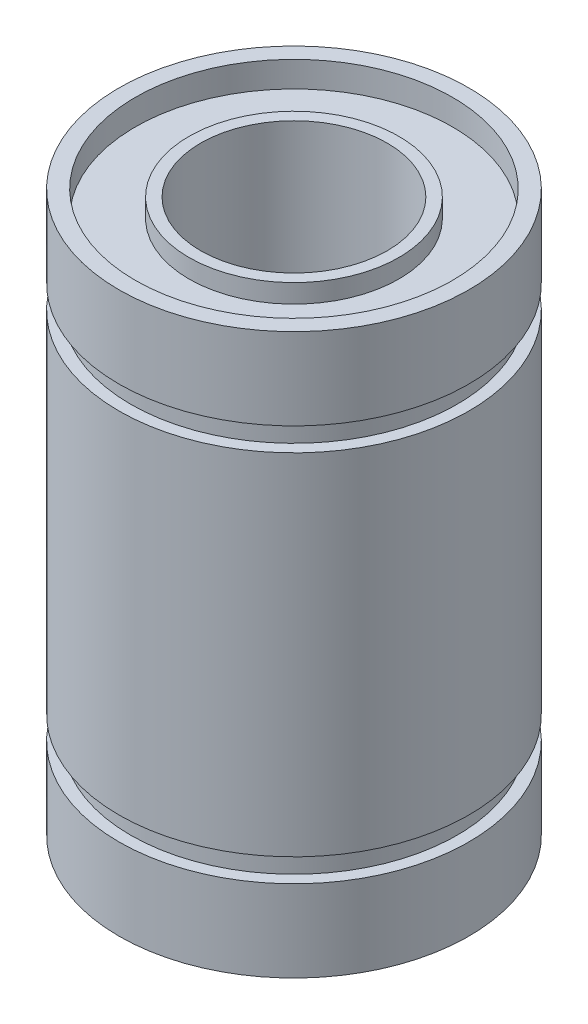
ISO-10303-21;
HEADER;
FILE_DESCRIPTION(('STEP AP214'),'2;1');
FILE_NAME('part.step','',(''),(''),'','','');
FILE_SCHEMA(('AUTOMOTIVE_DESIGN { 1 0 10303 214 1 1 1 1 }'));
ENDSEC;
DATA;
#1=APPLICATION_CONTEXT('core data for automotive mechanical design processes');
#2=APPLICATION_PROTOCOL_DEFINITION('international standard','automotive_design',2000,#1);
#3=PRODUCT_CONTEXT('',#1,'mechanical');
#4=PRODUCT('Part','Part','',(#3));
#5=PRODUCT_RELATED_PRODUCT_CATEGORY('part','',(#4));
#6=PRODUCT_DEFINITION_FORMATION('','',#4);
#7=PRODUCT_DEFINITION_CONTEXT('part definition',#1,'design');
#8=PRODUCT_DEFINITION('design','',#6,#7);
#9=PRODUCT_DEFINITION_SHAPE('','',#8);
#10=(LENGTH_UNIT() NAMED_UNIT(*) SI_UNIT(.MILLI.,.METRE.));
#11=(NAMED_UNIT(*) PLANE_ANGLE_UNIT() SI_UNIT($,.RADIAN.));
#12=(NAMED_UNIT(*) SI_UNIT($,.STERADIAN.) SOLID_ANGLE_UNIT());
#13=UNCERTAINTY_MEASURE_WITH_UNIT(LENGTH_MEASURE(1.E-05),#10,'distance_accuracy_value','');
#14=(GEOMETRIC_REPRESENTATION_CONTEXT(3) GLOBAL_UNCERTAINTY_ASSIGNED_CONTEXT((#13)) GLOBAL_UNIT_ASSIGNED_CONTEXT((#10,
#11,#12)) REPRESENTATION_CONTEXT('',''));
#15=CARTESIAN_POINT('',(0.,0.,0.));
#16=DIRECTION('',(0.,0.,1.));
#17=DIRECTION('',(1.,0.,0.));
#18=AXIS2_PLACEMENT_3D('',#15,#16,#17);
#19=CARTESIAN_POINT('',(0.,-12.,0.));
#20=DIRECTION('',(0.,1.,0.));
#21=DIRECTION('',(0.,0.,1.));
#22=AXIS2_PLACEMENT_3D('',#19,#20,#21);
#23=CYLINDRICAL_SURFACE('',#22,4.);
#24=CARTESIAN_POINT('',(0.,11.7,0.));
#25=DIRECTION('',(0.,1.,0.));
#26=DIRECTION('',(0.,0.,1.));
#27=AXIS2_PLACEMENT_3D('',#24,#25,#26);
#28=CIRCLE('',#27,4.);
#29=CARTESIAN_POINT('',(0.,11.7,4.));
#30=VERTEX_POINT('',#29);
#31=EDGE_CURVE('E78',#30,#30,#28,.T.);
#32=ORIENTED_EDGE('',*,*,#31,.T.);
#33=EDGE_LOOP('',(#32));
#34=FACE_BOUND('',#33,.T.);
#35=CARTESIAN_POINT('',(0.,-11.7,0.));
#36=DIRECTION('',(0.,1.,0.));
#37=DIRECTION('',(0.,0.,1.));
#38=AXIS2_PLACEMENT_3D('',#35,#36,#37);
#39=CIRCLE('',#38,4.);
#40=CARTESIAN_POINT('',(0.,-11.7,4.));
#41=VERTEX_POINT('',#40);
#42=EDGE_CURVE('E114',#41,#41,#39,.T.);
#43=ORIENTED_EDGE('',*,*,#42,.F.);
#44=EDGE_LOOP('',(#43));
#45=FACE_BOUND('',#44,.T.);
#46=ADVANCED_FACE('F44',(#34,#45),#23,.F.);
#47=CARTESIAN_POINT('',(0.,-12.,0.));
#48=DIRECTION('',(0.,1.,0.));
#49=DIRECTION('',(0.,0.,1.));
#50=AXIS2_PLACEMENT_3D('',#47,#48,#49);
#51=PLANE('',#50);
#52=CARTESIAN_POINT('',(0.,-12.,0.));
#53=DIRECTION('',(0.,1.,0.));
#54=DIRECTION('',(0.,0.,1.));
#55=AXIS2_PLACEMENT_3D('',#52,#53,#54);
#56=CIRCLE('',#55,7.5);
#57=CARTESIAN_POINT('',(0.,-12.,7.5));
#58=VERTEX_POINT('',#57);
#59=EDGE_CURVE('E48',#58,#58,#56,.T.);
#60=ORIENTED_EDGE('',*,*,#59,.F.);
#61=EDGE_LOOP('',(#60));
#62=FACE_BOUND('',#61,.T.);
#63=CARTESIAN_POINT('',(0.,-12.,0.));
#64=DIRECTION('',(0.,1.,0.));
#65=DIRECTION('',(0.,0.,1.));
#66=AXIS2_PLACEMENT_3D('',#63,#64,#65);
#67=CIRCLE('',#66,6.8);
#68=CARTESIAN_POINT('',(0.,-12.,6.8));
#69=VERTEX_POINT('',#68);
#70=EDGE_CURVE('E107',#69,#69,#67,.T.);
#71=ORIENTED_EDGE('',*,*,#70,.T.);
#72=EDGE_LOOP('',(#71));
#73=FACE_BOUND('',#72,.T.);
#74=ADVANCED_FACE('F152',(#62,#73),#51,.F.);
#75=CARTESIAN_POINT('',(0.,12.,0.));
#76=DIRECTION('',(0.,-1.,0.));
#77=DIRECTION('',(0.,0.,-1.));
#78=AXIS2_PLACEMENT_3D('',#75,#76,#77);
#79=CYLINDRICAL_SURFACE('',#78,7.5);
#80=CARTESIAN_POINT('',(0.,7.5,0.));
#81=DIRECTION('',(0.,1.,0.));
#82=DIRECTION('',(0.,0.,1.));
#83=AXIS2_PLACEMENT_3D('',#80,#81,#82);
#84=CIRCLE('',#83,7.5);
#85=CARTESIAN_POINT('',(0.,7.5,7.5));
#86=VERTEX_POINT('',#85);
#87=EDGE_CURVE('E57',#86,#86,#84,.T.);
#88=ORIENTED_EDGE('',*,*,#87,.F.);
#89=EDGE_LOOP('',(#88));
#90=FACE_BOUND('',#89,.T.);
#91=CARTESIAN_POINT('',(0.,-7.5,0.));
#92=DIRECTION('',(0.,1.,0.));
#93=DIRECTION('',(0.,0.,1.));
#94=AXIS2_PLACEMENT_3D('',#91,#92,#93);
#95=CIRCLE('',#94,7.5);
#96=CARTESIAN_POINT('',(0.,-7.5,7.5));
#97=VERTEX_POINT('',#96);
#98=EDGE_CURVE('E94',#97,#97,#95,.T.);
#99=ORIENTED_EDGE('',*,*,#98,.T.);
#100=EDGE_LOOP('',(#99));
#101=FACE_BOUND('',#100,.T.);
#102=ADVANCED_FACE('F158',(#90,#101),#79,.T.);
#103=CARTESIAN_POINT('',(0.,12.,0.));
#104=DIRECTION('',(0.,1.,0.));
#105=DIRECTION('',(0.,0.,1.));
#106=AXIS2_PLACEMENT_3D('',#103,#104,#105);
#107=PLANE('',#106);
#108=CARTESIAN_POINT('',(0.,12.,0.));
#109=DIRECTION('',(0.,1.,0.));
#110=DIRECTION('',(0.,0.,1.));
#111=AXIS2_PLACEMENT_3D('',#108,#109,#110);
#112=CIRCLE('',#111,7.5);
#113=CARTESIAN_POINT('',(0.,12.,7.5));
#114=VERTEX_POINT('',#113);
#115=EDGE_CURVE('E10',#114,#114,#112,.T.);
#116=ORIENTED_EDGE('',*,*,#115,.T.);
#117=EDGE_LOOP('',(#116));
#118=FACE_BOUND('',#117,.T.);
#119=CARTESIAN_POINT('',(0.,12.,0.));
#120=DIRECTION('',(0.,1.,0.));
#121=DIRECTION('',(0.,0.,1.));
#122=AXIS2_PLACEMENT_3D('',#119,#120,#121);
#123=CIRCLE('',#122,6.8);
#124=CARTESIAN_POINT('',(0.,12.,6.8));
#125=VERTEX_POINT('',#124);
#126=EDGE_CURVE('E71',#125,#125,#123,.T.);
#127=ORIENTED_EDGE('',*,*,#126,.F.);
#128=EDGE_LOOP('',(#127));
#129=FACE_BOUND('',#128,.T.);
#130=ADVANCED_FACE('F164',(#118,#129),#107,.T.);
#131=CARTESIAN_POINT('',(0.,-8.5,0.));
#132=DIRECTION('',(0.,1.,0.));
#133=DIRECTION('',(0.,0.,1.));
#134=AXIS2_PLACEMENT_3D('',#131,#132,#133);
#135=CIRCLE('',#134,7.5);
#136=CARTESIAN_POINT('',(0.,-8.5,7.5));
#137=VERTEX_POINT('',#136);
#138=EDGE_CURVE('E95',#137,#137,#135,.T.);
#139=ORIENTED_EDGE('',*,*,#138,.F.);
#140=EDGE_LOOP('',(#139));
#141=FACE_BOUND('',#140,.T.);
#142=ORIENTED_EDGE('',*,*,#59,.T.);
#143=EDGE_LOOP('',(#142));
#144=FACE_BOUND('',#143,.T.);
#145=ADVANCED_FACE('F166',(#141,#144),#79,.T.);
#146=CARTESIAN_POINT('',(0.,8.5,0.));
#147=DIRECTION('',(0.,1.,0.));
#148=DIRECTION('',(0.,0.,1.));
#149=AXIS2_PLACEMENT_3D('',#146,#147,#148);
#150=CIRCLE('',#149,7.5);
#151=CARTESIAN_POINT('',(0.,8.5,7.5));
#152=VERTEX_POINT('',#151);
#153=EDGE_CURVE('E59',#152,#152,#150,.T.);
#154=ORIENTED_EDGE('',*,*,#153,.T.);
#155=EDGE_LOOP('',(#154));
#156=FACE_BOUND('',#155,.T.);
#157=ORIENTED_EDGE('',*,*,#115,.F.);
#158=EDGE_LOOP('',(#157));
#159=FACE_BOUND('',#158,.T.);
#160=ADVANCED_FACE('F46',(#156,#159),#79,.T.);
#161=CARTESIAN_POINT('',(0.,7.5,0.));
#162=DIRECTION('',(0.,1.,0.));
#163=DIRECTION('',(0.,0.,1.));
#164=AXIS2_PLACEMENT_3D('',#161,#162,#163);
#165=PLANE('',#164);
#166=CARTESIAN_POINT('',(0.,7.5,0.));
#167=DIRECTION('',(0.,1.,0.));
#168=DIRECTION('',(0.,0.,1.));
#169=AXIS2_PLACEMENT_3D('',#166,#167,#168);
#170=CIRCLE('',#169,7.);
#171=CARTESIAN_POINT('',(0.,7.5,7.));
#172=VERTEX_POINT('',#171);
#173=EDGE_CURVE('E63',#172,#172,#170,.T.);
#174=ORIENTED_EDGE('',*,*,#173,.F.);
#175=EDGE_LOOP('',(#174));
#176=FACE_BOUND('',#175,.T.);
#177=ORIENTED_EDGE('',*,*,#87,.T.);
#178=EDGE_LOOP('',(#177));
#179=FACE_BOUND('',#178,.T.);
#180=ADVANCED_FACE('F206',(#176,#179),#165,.T.);
#181=CARTESIAN_POINT('',(0.,8.5,0.));
#182=DIRECTION('',(0.,1.,0.));
#183=DIRECTION('',(0.,0.,1.));
#184=AXIS2_PLACEMENT_3D('',#181,#182,#183);
#185=PLANE('',#184);
#186=CARTESIAN_POINT('',(0.,8.5,0.));
#187=DIRECTION('',(0.,1.,0.));
#188=DIRECTION('',(0.,0.,1.));
#189=AXIS2_PLACEMENT_3D('',#186,#187,#188);
#190=CIRCLE('',#189,7.);
#191=CARTESIAN_POINT('',(0.,8.5,7.));
#192=VERTEX_POINT('',#191);
#193=EDGE_CURVE('E67',#192,#192,#190,.T.);
#194=ORIENTED_EDGE('',*,*,#193,.T.);
#195=EDGE_LOOP('',(#194));
#196=FACE_BOUND('',#195,.T.);
#197=ORIENTED_EDGE('',*,*,#153,.F.);
#198=EDGE_LOOP('',(#197));
#199=FACE_BOUND('',#198,.T.);
#200=ADVANCED_FACE('F162',(#196,#199),#185,.F.);
#201=CARTESIAN_POINT('',(0.,7.5,0.));
#202=DIRECTION('',(0.,1.,0.));
#203=DIRECTION('',(0.,0.,1.));
#204=AXIS2_PLACEMENT_3D('',#201,#202,#203);
#205=CYLINDRICAL_SURFACE('',#204,7.);
#206=ORIENTED_EDGE('',*,*,#173,.T.);
#207=EDGE_LOOP('',(#206));
#208=FACE_BOUND('',#207,.T.);
#209=ORIENTED_EDGE('',*,*,#193,.F.);
#210=EDGE_LOOP('',(#209));
#211=FACE_BOUND('',#210,.T.);
#212=ADVANCED_FACE('F180',(#208,#211),#205,.T.);
#213=CARTESIAN_POINT('',(0.,10.5,0.));
#214=DIRECTION('',(0.,1.,0.));
#215=DIRECTION('',(0.,0.,1.));
#216=AXIS2_PLACEMENT_3D('',#213,#214,#215);
#217=CYLINDRICAL_SURFACE('',#216,6.8);
#218=ORIENTED_EDGE('',*,*,#126,.T.);
#219=EDGE_LOOP('',(#218));
#220=FACE_BOUND('',#219,.T.);
#221=CARTESIAN_POINT('',(0.,10.9,0.));
#222=DIRECTION('',(0.,1.,0.));
#223=DIRECTION('',(0.,0.,1.));
#224=AXIS2_PLACEMENT_3D('',#221,#222,#223);
#225=CIRCLE('',#224,6.8);
#226=CARTESIAN_POINT('',(0.,10.9,6.8));
#227=VERTEX_POINT('',#226);
#228=EDGE_CURVE('E90',#227,#227,#225,.T.);
#229=ORIENTED_EDGE('',*,*,#228,.F.);
#230=EDGE_LOOP('',(#229));
#231=FACE_BOUND('',#230,.T.);
#232=ADVANCED_FACE('F176',(#220,#231),#217,.F.);
#233=CARTESIAN_POINT('',(0.,11.7,-4.));
#234=DIRECTION('',(0.,1.,0.));
#235=DIRECTION('',(0.,0.,1.));
#236=AXIS2_PLACEMENT_3D('',#233,#234,#235);
#237=PLANE('',#236);
#238=CARTESIAN_POINT('',(0.,11.7,0.));
#239=DIRECTION('',(0.,1.,0.));
#240=DIRECTION('',(0.,0.,1.));
#241=AXIS2_PLACEMENT_3D('',#238,#239,#240);
#242=CIRCLE('',#241,4.5);
#243=CARTESIAN_POINT('',(0.,11.7,4.5));
#244=VERTEX_POINT('',#243);
#245=EDGE_CURVE('E82',#244,#244,#242,.T.);
#246=ORIENTED_EDGE('',*,*,#245,.T.);
#247=EDGE_LOOP('',(#246));
#248=FACE_BOUND('',#247,.T.);
#249=ORIENTED_EDGE('',*,*,#31,.F.);
#250=EDGE_LOOP('',(#249));
#251=FACE_BOUND('',#250,.T.);
#252=ADVANCED_FACE('F179',(#248,#251),#237,.T.);
#253=CARTESIAN_POINT('',(0.,10.5,0.));
#254=DIRECTION('',(0.,1.,0.));
#255=DIRECTION('',(0.,0.,1.));
#256=AXIS2_PLACEMENT_3D('',#253,#254,#255);
#257=CYLINDRICAL_SURFACE('',#256,4.5);
#258=CARTESIAN_POINT('',(0.,10.9,0.));
#259=DIRECTION('',(0.,1.,0.));
#260=DIRECTION('',(0.,0.,1.));
#261=AXIS2_PLACEMENT_3D('',#258,#259,#260);
#262=CIRCLE('',#261,4.5);
#263=CARTESIAN_POINT('',(0.,10.9,4.5));
#264=VERTEX_POINT('',#263);
#265=EDGE_CURVE('E86',#264,#264,#262,.T.);
#266=ORIENTED_EDGE('',*,*,#265,.T.);
#267=EDGE_LOOP('',(#266));
#268=FACE_BOUND('',#267,.T.);
#269=ORIENTED_EDGE('',*,*,#245,.F.);
#270=EDGE_LOOP('',(#269));
#271=FACE_BOUND('',#270,.T.);
#272=ADVANCED_FACE('F188',(#268,#271),#257,.T.);
#273=CARTESIAN_POINT('',(0.,10.9,-4.5));
#274=DIRECTION('',(0.,1.,0.));
#275=DIRECTION('',(0.,0.,1.));
#276=AXIS2_PLACEMENT_3D('',#273,#274,#275);
#277=PLANE('',#276);
#278=ORIENTED_EDGE('',*,*,#228,.T.);
#279=EDGE_LOOP('',(#278));
#280=FACE_BOUND('',#279,.T.);
#281=ORIENTED_EDGE('',*,*,#265,.F.);
#282=EDGE_LOOP('',(#281));
#283=FACE_BOUND('',#282,.T.);
#284=ADVANCED_FACE('F184',(#280,#283),#277,.T.);
#285=CARTESIAN_POINT('',(0.,-7.5,0.));
#286=DIRECTION('',(0.,-1.,0.));
#287=DIRECTION('',(0.,0.,1.));
#288=AXIS2_PLACEMENT_3D('',#285,#286,#287);
#289=PLANE('',#288);
#290=ORIENTED_EDGE('',*,*,#98,.F.);
#291=EDGE_LOOP('',(#290));
#292=FACE_BOUND('',#291,.T.);
#293=CARTESIAN_POINT('',(0.,-7.5,0.));
#294=DIRECTION('',(0.,1.,0.));
#295=DIRECTION('',(0.,0.,1.));
#296=AXIS2_PLACEMENT_3D('',#293,#294,#295);
#297=CIRCLE('',#296,7.);
#298=CARTESIAN_POINT('',(0.,-7.5,7.));
#299=VERTEX_POINT('',#298);
#300=EDGE_CURVE('E99',#299,#299,#297,.T.);
#301=ORIENTED_EDGE('',*,*,#300,.T.);
#302=EDGE_LOOP('',(#301));
#303=FACE_BOUND('',#302,.T.);
#304=ADVANCED_FACE('F187',(#292,#303),#289,.T.);
#305=CARTESIAN_POINT('',(0.,-8.5,0.));
#306=DIRECTION('',(0.,-1.,0.));
#307=DIRECTION('',(0.,0.,1.));
#308=AXIS2_PLACEMENT_3D('',#305,#306,#307);
#309=PLANE('',#308);
#310=ORIENTED_EDGE('',*,*,#138,.T.);
#311=EDGE_LOOP('',(#310));
#312=FACE_BOUND('',#311,.T.);
#313=CARTESIAN_POINT('',(0.,-8.5,0.));
#314=DIRECTION('',(0.,1.,0.));
#315=DIRECTION('',(0.,0.,1.));
#316=AXIS2_PLACEMENT_3D('',#313,#314,#315);
#317=CIRCLE('',#316,7.);
#318=CARTESIAN_POINT('',(0.,-8.5,7.));
#319=VERTEX_POINT('',#318);
#320=EDGE_CURVE('E103',#319,#319,#317,.T.);
#321=ORIENTED_EDGE('',*,*,#320,.F.);
#322=EDGE_LOOP('',(#321));
#323=FACE_BOUND('',#322,.T.);
#324=ADVANCED_FACE('F223',(#312,#323),#309,.F.);
#325=CARTESIAN_POINT('',(0.,-7.5,0.));
#326=DIRECTION('',(0.,-1.,0.));
#327=DIRECTION('',(0.,0.,-1.));
#328=AXIS2_PLACEMENT_3D('',#325,#326,#327);
#329=CYLINDRICAL_SURFACE('',#328,7.);
#330=ORIENTED_EDGE('',*,*,#300,.F.);
#331=EDGE_LOOP('',(#330));
#332=FACE_BOUND('',#331,.T.);
#333=ORIENTED_EDGE('',*,*,#320,.T.);
#334=EDGE_LOOP('',(#333));
#335=FACE_BOUND('',#334,.T.);
#336=ADVANCED_FACE('F227',(#332,#335),#329,.T.);
#337=CARTESIAN_POINT('',(0.,-10.5,0.));
#338=DIRECTION('',(0.,-1.,0.));
#339=DIRECTION('',(0.,0.,1.));
#340=AXIS2_PLACEMENT_3D('',#337,#338,#339);
#341=CYLINDRICAL_SURFACE('',#340,6.8);
#342=ORIENTED_EDGE('',*,*,#70,.F.);
#343=EDGE_LOOP('',(#342));
#344=FACE_BOUND('',#343,.T.);
#345=CARTESIAN_POINT('',(0.,-10.9,0.));
#346=DIRECTION('',(0.,1.,0.));
#347=DIRECTION('',(0.,0.,1.));
#348=AXIS2_PLACEMENT_3D('',#345,#346,#347);
#349=CIRCLE('',#348,6.8);
#350=CARTESIAN_POINT('',(0.,-10.9,6.8));
#351=VERTEX_POINT('',#350);
#352=EDGE_CURVE('E126',#351,#351,#349,.T.);
#353=ORIENTED_EDGE('',*,*,#352,.T.);
#354=EDGE_LOOP('',(#353));
#355=FACE_BOUND('',#354,.T.);
#356=ADVANCED_FACE('F131',(#344,#355),#341,.F.);
#357=CARTESIAN_POINT('',(0.,-11.7,-4.));
#358=DIRECTION('',(0.,-1.,0.));
#359=DIRECTION('',(0.,0.,1.));
#360=AXIS2_PLACEMENT_3D('',#357,#358,#359);
#361=PLANE('',#360);
#362=CARTESIAN_POINT('',(0.,-11.7,0.));
#363=DIRECTION('',(0.,1.,0.));
#364=DIRECTION('',(0.,0.,1.));
#365=AXIS2_PLACEMENT_3D('',#362,#363,#364);
#366=CIRCLE('',#365,4.5);
#367=CARTESIAN_POINT('',(0.,-11.7,4.5));
#368=VERTEX_POINT('',#367);
#369=EDGE_CURVE('E118',#368,#368,#366,.T.);
#370=ORIENTED_EDGE('',*,*,#369,.F.);
#371=EDGE_LOOP('',(#370));
#372=FACE_BOUND('',#371,.T.);
#373=ORIENTED_EDGE('',*,*,#42,.T.);
#374=EDGE_LOOP('',(#373));
#375=FACE_BOUND('',#374,.T.);
#376=ADVANCED_FACE('F142',(#372,#375),#361,.T.);
#377=CARTESIAN_POINT('',(0.,-10.5,0.));
#378=DIRECTION('',(0.,-1.,0.));
#379=DIRECTION('',(0.,0.,1.));
#380=AXIS2_PLACEMENT_3D('',#377,#378,#379);
#381=CYLINDRICAL_SURFACE('',#380,4.5);
#382=CARTESIAN_POINT('',(0.,-10.9,0.));
#383=DIRECTION('',(0.,1.,0.));
#384=DIRECTION('',(0.,0.,1.));
#385=AXIS2_PLACEMENT_3D('',#382,#383,#384);
#386=CIRCLE('',#385,4.5);
#387=CARTESIAN_POINT('',(0.,-10.9,4.5));
#388=VERTEX_POINT('',#387);
#389=EDGE_CURVE('E122',#388,#388,#386,.T.);
#390=ORIENTED_EDGE('',*,*,#389,.F.);
#391=EDGE_LOOP('',(#390));
#392=FACE_BOUND('',#391,.T.);
#393=ORIENTED_EDGE('',*,*,#369,.T.);
#394=EDGE_LOOP('',(#393));
#395=FACE_BOUND('',#394,.T.);
#396=ADVANCED_FACE('F136',(#392,#395),#381,.T.);
#397=CARTESIAN_POINT('',(0.,-10.9,-4.5));
#398=DIRECTION('',(0.,-1.,0.));
#399=DIRECTION('',(0.,0.,1.));
#400=AXIS2_PLACEMENT_3D('',#397,#398,#399);
#401=PLANE('',#400);
#402=ORIENTED_EDGE('',*,*,#352,.F.);
#403=EDGE_LOOP('',(#402));
#404=FACE_BOUND('',#403,.T.);
#405=ORIENTED_EDGE('',*,*,#389,.T.);
#406=EDGE_LOOP('',(#405));
#407=FACE_BOUND('',#406,.T.);
#408=ADVANCED_FACE('F133',(#404,#407),#401,.T.);
#409=CLOSED_SHELL('',(#46,#74,#102,#130,#145,#160,#180,#200,#212,#232,#252,#272,#284,#304,#324,
#336,#356,#376,#396,#408));
#410=MANIFOLD_SOLID_BREP('B2',#409);
#411=ADVANCED_BREP_SHAPE_REPRESENTATION('',(#18,#410),#14);
#412=SHAPE_DEFINITION_REPRESENTATION(#9,#411);
ENDSEC;
END-ISO-10303-21;
